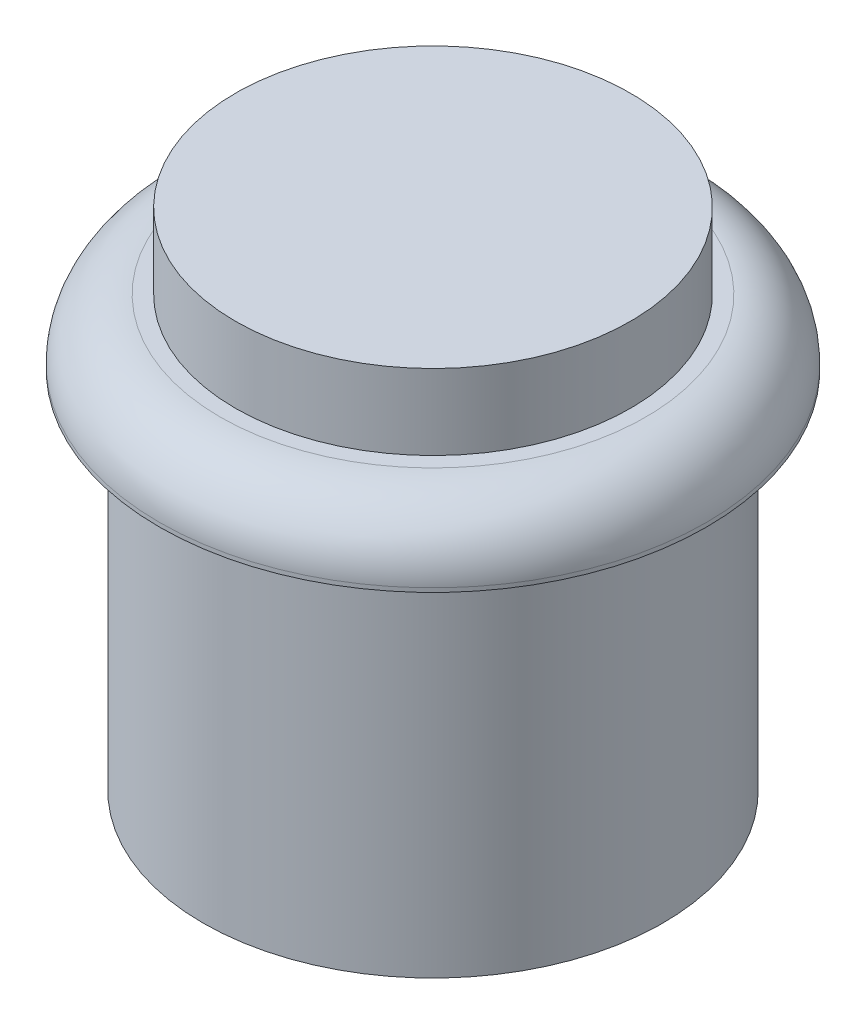
ISO-10303-21;
HEADER;
FILE_DESCRIPTION(('STEP AP214'),'2;1');
FILE_NAME('part.step','',(''),(''),'','','');
FILE_SCHEMA(('AUTOMOTIVE_DESIGN { 1 0 10303 214 1 1 1 1 }'));
ENDSEC;
DATA;
#1=APPLICATION_CONTEXT('core data for automotive mechanical design processes');
#2=APPLICATION_PROTOCOL_DEFINITION('international standard','automotive_design',2000,#1);
#3=PRODUCT_CONTEXT('',#1,'mechanical');
#4=PRODUCT('Part','Part','',(#3));
#5=PRODUCT_RELATED_PRODUCT_CATEGORY('part','',(#4));
#6=PRODUCT_DEFINITION_FORMATION('','',#4);
#7=PRODUCT_DEFINITION_CONTEXT('part definition',#1,'design');
#8=PRODUCT_DEFINITION('design','',#6,#7);
#9=PRODUCT_DEFINITION_SHAPE('','',#8);
#10=(LENGTH_UNIT() NAMED_UNIT(*) SI_UNIT(.MILLI.,.METRE.));
#11=(NAMED_UNIT(*) PLANE_ANGLE_UNIT() SI_UNIT($,.RADIAN.));
#12=(NAMED_UNIT(*) SI_UNIT($,.STERADIAN.) SOLID_ANGLE_UNIT());
#13=UNCERTAINTY_MEASURE_WITH_UNIT(LENGTH_MEASURE(1.E-05),#10,'distance_accuracy_value','');
#14=(GEOMETRIC_REPRESENTATION_CONTEXT(3) GLOBAL_UNCERTAINTY_ASSIGNED_CONTEXT((#13)) GLOBAL_UNIT_ASSIGNED_CONTEXT((#10,
#11,#12)) REPRESENTATION_CONTEXT('',''));
#15=CARTESIAN_POINT('',(0.,0.,0.));
#16=DIRECTION('',(0.,0.,1.));
#17=DIRECTION('',(1.,0.,0.));
#18=AXIS2_PLACEMENT_3D('',#15,#16,#17);
#19=CARTESIAN_POINT('',(0.,-18.,0.));
#20=DIRECTION('',(0.,1.,0.));
#21=DIRECTION('',(0.,0.,1.));
#22=AXIS2_PLACEMENT_3D('',#19,#20,#21);
#23=CYLINDRICAL_SURFACE('',#22,11.35);
#24=CARTESIAN_POINT('',(0.,-18.,0.));
#25=DIRECTION('',(0.,1.,0.));
#26=DIRECTION('',(0.,0.,1.));
#27=AXIS2_PLACEMENT_3D('',#24,#25,#26);
#28=CIRCLE('',#27,11.35);
#29=CARTESIAN_POINT('',(0.,-18.,11.35));
#30=VERTEX_POINT('',#29);
#31=EDGE_CURVE('E48',#30,#30,#28,.T.);
#32=ORIENTED_EDGE('',*,*,#31,.T.);
#33=EDGE_LOOP('',(#32));
#34=FACE_BOUND('',#33,.T.);
#35=CARTESIAN_POINT('',(0.,0.,0.));
#36=DIRECTION('',(0.,1.,0.));
#37=DIRECTION('',(0.,0.,1.));
#38=AXIS2_PLACEMENT_3D('',#35,#36,#37);
#39=CIRCLE('',#38,11.35);
#40=CARTESIAN_POINT('',(0.,0.,11.35));
#41=VERTEX_POINT('',#40);
#42=EDGE_CURVE('E52',#41,#41,#39,.T.);
#43=ORIENTED_EDGE('',*,*,#42,.F.);
#44=EDGE_LOOP('',(#43));
#45=FACE_BOUND('',#44,.T.);
#46=ADVANCED_FACE('F37',(#34,#45),#23,.T.);
#47=CARTESIAN_POINT('',(0.,-18.,0.));
#48=DIRECTION('',(0.,1.,0.));
#49=DIRECTION('',(0.,0.,1.));
#50=AXIS2_PLACEMENT_3D('',#47,#48,#49);
#51=PLANE('',#50);
#52=ORIENTED_EDGE('',*,*,#31,.F.);
#53=EDGE_LOOP('',(#52));
#54=FACE_BOUND('',#53,.T.);
#55=ADVANCED_FACE('F87',(#54),#51,.F.);
#56=CARTESIAN_POINT('',(0.,3.2,0.));
#57=DIRECTION('',(0.,-1.,0.));
#58=DIRECTION('',(0.,0.,-1.));
#59=AXIS2_PLACEMENT_3D('',#56,#57,#58);
#60=CYLINDRICAL_SURFACE('',#59,13.5);
#61=CARTESIAN_POINT('',(0.,0.2,0.));
#62=DIRECTION('',(0.,1.,0.));
#63=DIRECTION('',(0.,0.,1.));
#64=AXIS2_PLACEMENT_3D('',#61,#62,#63);
#65=CIRCLE('',#64,13.5);
#66=CARTESIAN_POINT('',(0.,0.2,13.5));
#67=VERTEX_POINT('',#66);
#68=EDGE_CURVE('E10',#67,#67,#65,.F.);
#69=ORIENTED_EDGE('',*,*,#68,.T.);
#70=EDGE_LOOP('',(#69));
#71=FACE_BOUND('',#70,.T.);
#72=CARTESIAN_POINT('',(0.,0.,0.));
#73=DIRECTION('',(0.,1.,0.));
#74=DIRECTION('',(0.,0.,1.));
#75=AXIS2_PLACEMENT_3D('',#72,#73,#74);
#76=CIRCLE('',#75,13.5);
#77=CARTESIAN_POINT('',(0.,0.,13.5));
#78=VERTEX_POINT('',#77);
#79=EDGE_CURVE('E56',#78,#78,#76,.T.);
#80=ORIENTED_EDGE('',*,*,#79,.T.);
#81=EDGE_LOOP('',(#80));
#82=FACE_BOUND('',#81,.T.);
#83=ADVANCED_FACE('F78',(#71,#82),#60,.T.);
#84=CARTESIAN_POINT('',(0.,3.2,0.));
#85=DIRECTION('',(0.,1.,0.));
#86=DIRECTION('',(0.,0.,1.));
#87=AXIS2_PLACEMENT_3D('',#84,#85,#86);
#88=PLANE('',#87);
#89=CARTESIAN_POINT('',(0.,3.2,0.));
#90=DIRECTION('',(0.,1.,0.));
#91=DIRECTION('',(0.,0.,1.));
#92=AXIS2_PLACEMENT_3D('',#89,#90,#91);
#93=CIRCLE('',#92,9.75);
#94=CARTESIAN_POINT('',(0.,3.2,9.75));
#95=VERTEX_POINT('',#94);
#96=EDGE_CURVE('E61',#95,#95,#93,.T.);
#97=ORIENTED_EDGE('',*,*,#96,.F.);
#98=EDGE_LOOP('',(#97));
#99=FACE_BOUND('',#98,.T.);
#100=CARTESIAN_POINT('',(0.,3.2,0.));
#101=DIRECTION('',(0.,1.,0.));
#102=DIRECTION('',(0.,0.,1.));
#103=AXIS2_PLACEMENT_3D('',#100,#101,#102);
#104=CIRCLE('',#103,10.5);
#105=CARTESIAN_POINT('',(0.,3.2,10.5));
#106=VERTEX_POINT('',#105);
#107=EDGE_CURVE('E44',#106,#106,#104,.T.);
#108=ORIENTED_EDGE('',*,*,#107,.T.);
#109=EDGE_LOOP('',(#108));
#110=FACE_BOUND('',#109,.T.);
#111=ADVANCED_FACE('F75',(#99,#110),#88,.T.);
#112=CARTESIAN_POINT('',(0.,0.,0.));
#113=DIRECTION('',(0.,1.,0.));
#114=DIRECTION('',(0.,0.,1.));
#115=AXIS2_PLACEMENT_3D('',#112,#113,#114);
#116=PLANE('',#115);
#117=ORIENTED_EDGE('',*,*,#42,.T.);
#118=EDGE_LOOP('',(#117));
#119=FACE_BOUND('',#118,.T.);
#120=ORIENTED_EDGE('',*,*,#79,.F.);
#121=EDGE_LOOP('',(#120));
#122=FACE_BOUND('',#121,.T.);
#123=ADVANCED_FACE('F77',(#119,#122),#116,.F.);
#124=CARTESIAN_POINT('',(0.,0.2,0.));
#125=DIRECTION('',(0.,1.,0.));
#126=DIRECTION('',(0.,0.,1.));
#127=AXIS2_PLACEMENT_3D('',#124,#125,#126);
#128=TOROIDAL_SURFACE('',#127,10.5,3.);
#129=ORIENTED_EDGE('',*,*,#68,.F.);
#130=EDGE_LOOP('',(#129));
#131=FACE_BOUND('',#130,.T.);
#132=ORIENTED_EDGE('',*,*,#107,.F.);
#133=EDGE_LOOP('',(#132));
#134=FACE_BOUND('',#133,.T.);
#135=ADVANCED_FACE('F39',(#131,#134),#128,.T.);
#136=CARTESIAN_POINT('',(0.,6.92,0.));
#137=DIRECTION('',(0.,-1.,0.));
#138=DIRECTION('',(0.,0.,-1.));
#139=AXIS2_PLACEMENT_3D('',#136,#137,#138);
#140=CYLINDRICAL_SURFACE('',#139,9.75);
#141=CARTESIAN_POINT('',(0.,6.92,0.));
#142=DIRECTION('',(0.,1.,0.));
#143=DIRECTION('',(0.,0.,1.));
#144=AXIS2_PLACEMENT_3D('',#141,#142,#143);
#145=CIRCLE('',#144,9.75);
#146=CARTESIAN_POINT('',(0.,6.92,9.75));
#147=VERTEX_POINT('',#146);
#148=EDGE_CURVE('E60',#147,#147,#145,.T.);
#149=ORIENTED_EDGE('',*,*,#148,.F.);
#150=EDGE_LOOP('',(#149));
#151=FACE_BOUND('',#150,.T.);
#152=ORIENTED_EDGE('',*,*,#96,.T.);
#153=EDGE_LOOP('',(#152));
#154=FACE_BOUND('',#153,.T.);
#155=ADVANCED_FACE('F69',(#151,#154),#140,.T.);
#156=CARTESIAN_POINT('',(0.,6.92,0.));
#157=DIRECTION('',(0.,1.,0.));
#158=DIRECTION('',(0.,0.,1.));
#159=AXIS2_PLACEMENT_3D('',#156,#157,#158);
#160=PLANE('',#159);
#161=ORIENTED_EDGE('',*,*,#148,.T.);
#162=EDGE_LOOP('',(#161));
#163=FACE_BOUND('',#162,.T.);
#164=ADVANCED_FACE('F67',(#163),#160,.T.);
#165=CLOSED_SHELL('',(#46,#55,#83,#111,#123,#135,#155,#164));
#166=MANIFOLD_SOLID_BREP('B2',#165);
#167=ADVANCED_BREP_SHAPE_REPRESENTATION('',(#18,#166),#14);
#168=SHAPE_DEFINITION_REPRESENTATION(#9,#167);
ENDSEC;
END-ISO-10303-21;
